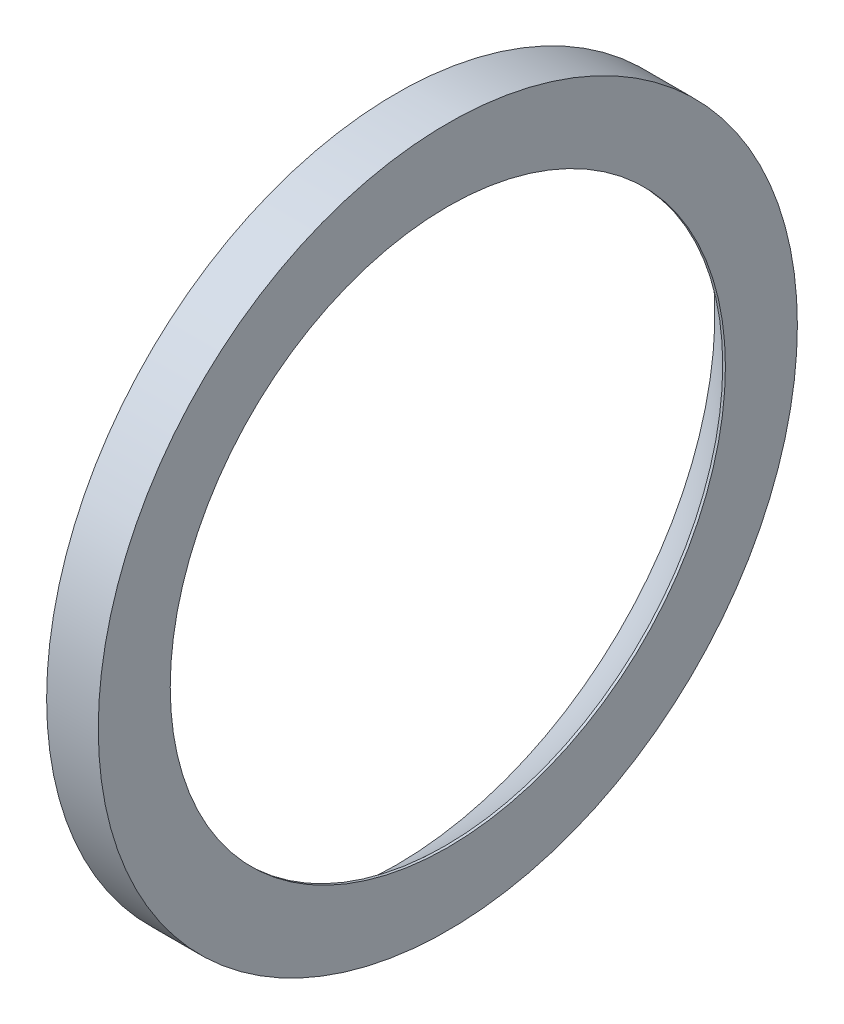
ISO-10303-21;
HEADER;
FILE_DESCRIPTION(('STEP AP214'),'2;1');
FILE_NAME('part.step','',(''),(''),'','','');
FILE_SCHEMA(('AUTOMOTIVE_DESIGN { 1 0 10303 214 1 1 1 1 }'));
ENDSEC;
DATA;
#1=APPLICATION_CONTEXT('core data for automotive mechanical design processes');
#2=APPLICATION_PROTOCOL_DEFINITION('international standard','automotive_design',2000,#1);
#3=PRODUCT_CONTEXT('',#1,'mechanical');
#4=PRODUCT('Part','Part','',(#3));
#5=PRODUCT_RELATED_PRODUCT_CATEGORY('part','',(#4));
#6=PRODUCT_DEFINITION_FORMATION('','',#4);
#7=PRODUCT_DEFINITION_CONTEXT('part definition',#1,'design');
#8=PRODUCT_DEFINITION('design','',#6,#7);
#9=PRODUCT_DEFINITION_SHAPE('','',#8);
#10=(LENGTH_UNIT() NAMED_UNIT(*) SI_UNIT(.MILLI.,.METRE.));
#11=(NAMED_UNIT(*) PLANE_ANGLE_UNIT() SI_UNIT($,.RADIAN.));
#12=(NAMED_UNIT(*) SI_UNIT($,.STERADIAN.) SOLID_ANGLE_UNIT());
#13=UNCERTAINTY_MEASURE_WITH_UNIT(LENGTH_MEASURE(1.E-05),#10,'distance_accuracy_value','');
#14=(GEOMETRIC_REPRESENTATION_CONTEXT(3) GLOBAL_UNCERTAINTY_ASSIGNED_CONTEXT((#13)) GLOBAL_UNIT_ASSIGNED_CONTEXT((#10,
#11,#12)) REPRESENTATION_CONTEXT('',''));
#15=CARTESIAN_POINT('',(0.,0.,0.));
#16=DIRECTION('',(0.,0.,1.));
#17=DIRECTION('',(1.,0.,0.));
#18=AXIS2_PLACEMENT_3D('',#15,#16,#17);
#19=CARTESIAN_POINT('',(0.,0.,0.));
#20=DIRECTION('',(-1.,0.,0.));
#21=DIRECTION('',(0.,1.,0.));
#22=AXIS2_PLACEMENT_3D('',#19,#20,#21);
#23=SPHERICAL_SURFACE('',#22,19.);
#24=CARTESIAN_POINT('',(13.3697419571209,0.,0.));
#25=DIRECTION('',(-1.,0.,0.));
#26=DIRECTION('',(0.,0.,1.));
#27=AXIS2_PLACEMENT_3D('',#24,#25,#26);
#28=CIRCLE('',#27,13.5);
#29=CARTESIAN_POINT('',(13.3697419571209,13.5,0.));
#30=VERTEX_POINT('',#29);
#31=EDGE_CURVE('E70',#30,#30,#28,.T.);
#32=CARTESIAN_POINT('',(10.988630487918,0.,0.));
#33=DIRECTION('',(-1.,0.,0.));
#34=DIRECTION('',(0.,0.,1.));
#35=AXIS2_PLACEMENT_3D('',#32,#33,#34);
#36=CIRCLE('',#35,15.5);
#37=CARTESIAN_POINT('',(10.988630487918,15.5,0.));
#38=VERTEX_POINT('',#37);
#39=EDGE_CURVE('E10',#38,#38,#36,.T.);
#40=CARTESIAN_POINT('',(13.3697419571209,13.5,0.));
#41=CARTESIAN_POINT('',(13.3467009667962,13.5228186748095,0.));
#42=CARTESIAN_POINT('',(13.3236015570779,13.54557836105,0.));
#43=CARTESIAN_POINT('',(13.277286506845,13.590979162163,0.));
#44=CARTESIAN_POINT('',(13.2540708663305,13.6136202770355,0.));
#45=CARTESIAN_POINT('',(13.2075239624964,13.6587833411827,0.));
#46=CARTESIAN_POINT('',(13.1841926991769,13.6813052904574,0.));
#47=CARTESIAN_POINT('',(13.1374151615717,13.726229433136,0.));
#48=CARTESIAN_POINT('',(13.1139688872861,13.74863162654,0.));
#49=CARTESIAN_POINT('',(13.0669619423839,13.7933156701207,0.));
#50=CARTESIAN_POINT('',(13.0434012717674,13.8155975202975,0.));
#51=CARTESIAN_POINT('',(12.9961661518967,13.8600402932823,0.));
#52=CARTESIAN_POINT('',(12.9724917026424,13.8822012160903,0.));
#53=CARTESIAN_POINT('',(12.9250296461562,13.92640155335,0.));
#54=CARTESIAN_POINT('',(12.9012420389243,13.9484409678018,0.));
#55=CARTESIAN_POINT('',(12.8535542901138,13.9923977105516,0.));
#56=CARTESIAN_POINT('',(12.8296541485353,14.0143150388496,0.));
#57=CARTESIAN_POINT('',(12.7817419576118,14.0580270346938,0.));
#58=CARTESIAN_POINT('',(12.7577299082668,14.07982170224,0.));
#59=CARTESIAN_POINT('',(12.7095945313247,14.1232878051987,0.));
#60=CARTESIAN_POINT('',(12.6854712037276,14.1449592406112,0.));
#61=CARTESIAN_POINT('',(12.6371139027127,14.1881783111511,0.));
#62=CARTESIAN_POINT('',(12.612879929295,14.2097259462786,0.));
#63=CARTESIAN_POINT('',(12.5643019719713,14.2526968513427,0.));
#64=CARTESIAN_POINT('',(12.5399579880653,14.2741201212794,0.));
#65=CARTESIAN_POINT('',(12.4911606479814,14.3168417343168,0.));
#66=CARTESIAN_POINT('',(12.4667072918036,14.3381400774175,0.));
#67=CARTESIAN_POINT('',(12.4176918482599,14.3806112784129,0.));
#68=CARTESIAN_POINT('',(12.393129760894,14.4017841363075,0.));
#69=CARTESIAN_POINT('',(12.3438974989085,14.4440038118104,0.));
#70=CARTESIAN_POINT('',(12.319227324289,14.4650506294187,0.));
#71=CARTESIAN_POINT('',(12.2697795345642,14.507017672573,0.));
#72=CARTESIAN_POINT('',(12.245001919459,14.5279378981189,0.));
#73=CARTESIAN_POINT('',(12.1953398983477,14.5696512086914,0.));
#74=CARTESIAN_POINT('',(12.1704554923416,14.590444293718,0.));
#75=CARTESIAN_POINT('',(12.120580541813,14.6319027781276,0.));
#76=CARTESIAN_POINT('',(12.0955899972905,14.6525681775108,0.));
#77=CARTESIAN_POINT('',(12.0455034248961,14.6937707488572,0.));
#78=CARTESIAN_POINT('',(12.0204073970242,14.7143079208205,0.));
#79=CARTESIAN_POINT('',(11.9701105158636,14.7552534989124,0.));
#80=CARTESIAN_POINT('',(11.9449096625748,14.7756619050411,0.));
#81=CARTESIAN_POINT('',(11.8944037912609,14.8163494164249,0.));
#82=CARTESIAN_POINT('',(11.8690987732358,14.83662852168,0.));
#83=CARTESIAN_POINT('',(11.8183852358609,14.8770568996674,0.));
#84=CARTESIAN_POINT('',(11.792976716511,14.8972061723997,0.));
#85=CARTESIAN_POINT('',(11.7420568426113,14.9373743570963,0.));
#86=CARTESIAN_POINT('',(11.7165454880616,14.9573932690606,0.));
#87=CARTESIAN_POINT('',(11.6654206125831,14.9973002073932,0.));
#88=CARTESIAN_POINT('',(11.6398070916544,15.0171882337616,0.));
#89=CARTESIAN_POINT('',(11.5884785549173,15.0568328795061,0.));
#90=CARTESIAN_POINT('',(11.5627635391089,15.0765894988822,0.));
#91=CARTESIAN_POINT('',(11.511232686773,15.115970812691,0.));
#92=CARTESIAN_POINT('',(11.4854168502454,15.1355955071238,0.));
#93=CARTESIAN_POINT('',(11.4336850332737,15.1747124565521,0.));
#94=CARTESIAN_POINT('',(11.4077690528295,15.1942047115477,0.));
#95=CARTESIAN_POINT('',(11.3558376274563,15.2330562710851,0.));
#96=CARTESIAN_POINT('',(11.3298221825272,15.2524155756268,0.));
#97=CARTESIAN_POINT('',(11.2776925102101,15.2910007267069,0.));
#98=CARTESIAN_POINT('',(11.2515782828222,15.3102265732453,0.));
#99=CARTESIAN_POINT('',(11.1992517302522,15.3485443043362,0.));
#100=CARTESIAN_POINT('',(11.17303940507,15.3676361888886,0.));
#101=CARTESIAN_POINT('',(11.1205173439661,15.405685495283,0.));
#102=CARTESIAN_POINT('',(11.0942076080442,15.4246429171249,0.));
#103=CARTESIAN_POINT('',(11.0414914157483,15.4624228018467,0.));
#104=CARTESIAN_POINT('',(11.0150849593743,15.4812452647267,0.));
#105=CARTESIAN_POINT('',(10.988630487918,15.5,0.));
#106=B_SPLINE_CURVE_WITH_KNOTS('',3,(#40,#41,#42,#43,#44,#45,#46,#47,#48,#49,#50,#51,#52,#53,
#54,#55,#56,#57,#58,#59,#60,#61,#62,#63,#64,#65,#66,#67,#68,#69,#70,#71,#72,#73,#74,#75,#76,#77,
#78,#79,#80,#81,#82,#83,#84,#85,#86,#87,#88,#89,#90,#91,#92,#93,#94,#95,#96,#97,#98,#99,#100,
#101,#102,#103,#104,#105),.UNSPECIFIED.,.F.,.F.,(4,2,2,2,2,2,2,2,2,2,2,2,2,2,2,2,2,2,2,2,2,2,2,
2,2,2,2,2,2,2,2,2,4),(0.,0.0972840774120867,0.194568154824174,0.291852232236258,
0.389136309648345,0.486420387060433,0.583704464472519,0.680988541884604,0.778272619296691,
0.875556696708779,0.972840774120866,1.07012485153295,1.16740892894504,1.26469300635712,
1.36197708376921,1.4592611611813,1.55654523859338,1.65382931600547,1.75111339341756,
1.84839747082964,1.94568154824173,2.04296562565382,2.1402497030659,2.23753378047799,
2.33481785789008,2.43210193530216,2.52938601271425,2.62667009012634,2.72395416753842,
2.82123824495051,2.9185223223626,3.01580639977468,3.11309047718677),.UNSPECIFIED.);
#107=EDGE_CURVE('BSEAM43',#30,#38,#106,.T.);
#108=ORIENTED_EDGE('',*,*,#31,.F.);
#109=ORIENTED_EDGE('',*,*,#39,.T.);
#110=ORIENTED_EDGE('',*,*,#107,.T.);
#111=ORIENTED_EDGE('',*,*,#107,.F.);
#112=EDGE_LOOP('',(#108,#110,#109,#111));
#113=FACE_BOUND('',#112,.T.);
#114=ADVANCED_FACE('F43',(#113),#23,.F.);
#115=CARTESIAN_POINT('',(10.988630487918,15.5,0.));
#116=DIRECTION('',(1.,0.,0.));
#117=DIRECTION('',(0.,0.,-1.));
#118=AXIS2_PLACEMENT_3D('',#115,#116,#117);
#119=PLANE('',#118);
#120=ORIENTED_EDGE('',*,*,#39,.F.);
#121=EDGE_LOOP('',(#120));
#122=FACE_BOUND('',#121,.T.);
#123=CARTESIAN_POINT('',(10.988630487918,0.,0.));
#124=DIRECTION('',(-1.,0.,0.));
#125=DIRECTION('',(0.,0.,1.));
#126=AXIS2_PLACEMENT_3D('',#123,#124,#125);
#127=CIRCLE('',#126,17.);
#128=CARTESIAN_POINT('',(10.988630487918,0.,17.));
#129=VERTEX_POINT('',#128);
#130=EDGE_CURVE('E50',#129,#129,#127,.T.);
#131=ORIENTED_EDGE('',*,*,#130,.T.);
#132=EDGE_LOOP('',(#131));
#133=FACE_BOUND('',#132,.T.);
#134=ADVANCED_FACE('F80',(#122,#133),#119,.F.);
#135=CARTESIAN_POINT('',(-18.7325036655949,0.,0.));
#136=DIRECTION('',(-1.,0.,0.));
#137=DIRECTION('',(0.,0.,1.));
#138=AXIS2_PLACEMENT_3D('',#135,#136,#137);
#139=CYLINDRICAL_SURFACE('',#138,17.);
#140=ORIENTED_EDGE('',*,*,#130,.F.);
#141=EDGE_LOOP('',(#140));
#142=FACE_BOUND('',#141,.T.);
#143=CARTESIAN_POINT('',(13.5,0.,0.));
#144=DIRECTION('',(-1.,0.,0.));
#145=DIRECTION('',(0.,0.,1.));
#146=AXIS2_PLACEMENT_3D('',#143,#144,#145);
#147=CIRCLE('',#146,17.);
#148=CARTESIAN_POINT('',(13.5,0.,17.));
#149=VERTEX_POINT('',#148);
#150=EDGE_CURVE('E57',#149,#149,#147,.T.);
#151=ORIENTED_EDGE('',*,*,#150,.T.);
#152=EDGE_LOOP('',(#151));
#153=FACE_BOUND('',#152,.T.);
#154=ADVANCED_FACE('F84',(#142,#153),#139,.T.);
#155=CARTESIAN_POINT('',(13.5,17.,0.));
#156=DIRECTION('',(-1.,0.,0.));
#157=DIRECTION('',(0.,0.,1.));
#158=AXIS2_PLACEMENT_3D('',#155,#156,#157);
#159=PLANE('',#158);
#160=ORIENTED_EDGE('',*,*,#150,.F.);
#161=EDGE_LOOP('',(#160));
#162=FACE_BOUND('',#161,.T.);
#163=CARTESIAN_POINT('',(13.5,0.,0.));
#164=DIRECTION('',(-1.,0.,0.));
#165=DIRECTION('',(0.,0.,1.));
#166=AXIS2_PLACEMENT_3D('',#163,#164,#165);
#167=CIRCLE('',#166,13.5);
#168=CARTESIAN_POINT('',(13.5,0.,13.5));
#169=VERTEX_POINT('',#168);
#170=EDGE_CURVE('E64',#169,#169,#167,.T.);
#171=ORIENTED_EDGE('',*,*,#170,.T.);
#172=EDGE_LOOP('',(#171));
#173=FACE_BOUND('',#172,.T.);
#174=ADVANCED_FACE('F89',(#162,#173),#159,.F.);
#175=CARTESIAN_POINT('',(-18.7325036655949,0.,0.));
#176=DIRECTION('',(-1.,0.,0.));
#177=DIRECTION('',(0.,0.,1.));
#178=AXIS2_PLACEMENT_3D('',#175,#176,#177);
#179=CYLINDRICAL_SURFACE('',#178,13.5);
#180=ORIENTED_EDGE('',*,*,#170,.F.);
#181=EDGE_LOOP('',(#180));
#182=FACE_BOUND('',#181,.T.);
#183=ORIENTED_EDGE('',*,*,#31,.T.);
#184=EDGE_LOOP('',(#183));
#185=FACE_BOUND('',#184,.T.);
#186=ADVANCED_FACE('F77',(#182,#185),#179,.F.);
#187=CLOSED_SHELL('',(#114,#134,#154,#174,#186));
#188=MANIFOLD_SOLID_BREP('B2',#187);
#189=ADVANCED_BREP_SHAPE_REPRESENTATION('',(#18,#188),#14);
#190=SHAPE_DEFINITION_REPRESENTATION(#9,#189);
ENDSEC;
END-ISO-10303-21;
